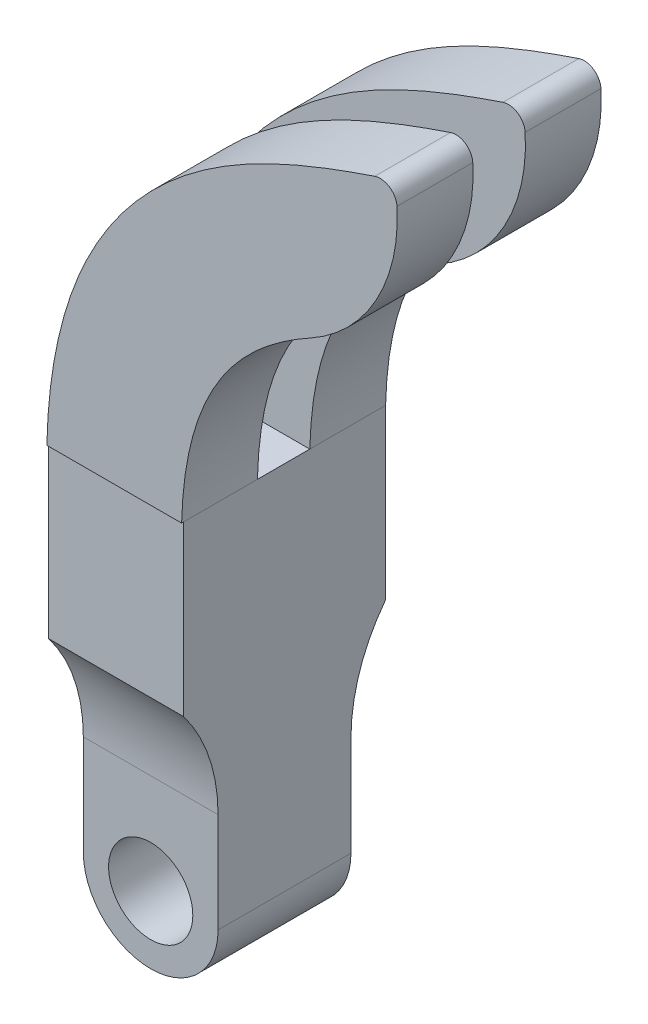
ISO-10303-21;
HEADER;
FILE_DESCRIPTION(('STEP AP214'),'2;1');
FILE_NAME('part.step','',(''),(''),'','','');
FILE_SCHEMA(('AUTOMOTIVE_DESIGN { 1 0 10303 214 1 1 1 1 }'));
ENDSEC;
DATA;
#1=APPLICATION_CONTEXT('core data for automotive mechanical design processes');
#2=APPLICATION_PROTOCOL_DEFINITION('international standard','automotive_design',2000,#1);
#3=PRODUCT_CONTEXT('',#1,'mechanical');
#4=PRODUCT('Part','Part','',(#3));
#5=PRODUCT_RELATED_PRODUCT_CATEGORY('part','',(#4));
#6=PRODUCT_DEFINITION_FORMATION('','',#4);
#7=PRODUCT_DEFINITION_CONTEXT('part definition',#1,'design');
#8=PRODUCT_DEFINITION('design','',#6,#7);
#9=PRODUCT_DEFINITION_SHAPE('','',#8);
#10=(LENGTH_UNIT() NAMED_UNIT(*) SI_UNIT(.MILLI.,.METRE.));
#11=(NAMED_UNIT(*) PLANE_ANGLE_UNIT() SI_UNIT($,.RADIAN.));
#12=(NAMED_UNIT(*) SI_UNIT($,.STERADIAN.) SOLID_ANGLE_UNIT());
#13=UNCERTAINTY_MEASURE_WITH_UNIT(LENGTH_MEASURE(1.E-05),#10,'distance_accuracy_value','');
#14=(GEOMETRIC_REPRESENTATION_CONTEXT(3) GLOBAL_UNCERTAINTY_ASSIGNED_CONTEXT((#13)) GLOBAL_UNIT_ASSIGNED_CONTEXT((#10,
#11,#12)) REPRESENTATION_CONTEXT('',''));
#15=CARTESIAN_POINT('',(0.,0.,0.));
#16=DIRECTION('',(0.,0.,1.));
#17=DIRECTION('',(1.,0.,0.));
#18=AXIS2_PLACEMENT_3D('',#15,#16,#17);
#19=CARTESIAN_POINT('',(0.,22.,0.));
#20=DIRECTION('',(0.,-1.,0.));
#21=DIRECTION('',(0.,0.,-1.));
#22=AXIS2_PLACEMENT_3D('',#19,#20,#21);
#23=PLANE('',#22);
#24=DIRECTION('',(1.,0.,0.));
#25=VECTOR('',#24,1.);
#26=CARTESIAN_POINT('',(-4.,22.,5.555));
#27=LINE('',#26,#25);
#28=CARTESIAN_POINT('',(-4.,22.,5.555));
#29=VERTEX_POINT('',#28);
#30=CARTESIAN_POINT('',(4.,22.,5.555));
#31=VERTEX_POINT('',#30);
#32=EDGE_CURVE('E170',#29,#31,#27,.T.);
#33=ORIENTED_EDGE('',*,*,#32,.T.);
#34=DIRECTION('',(0.,0.,-1.));
#35=VECTOR('',#34,1.);
#36=CARTESIAN_POINT('',(4.,22.,9.945));
#37=LINE('',#36,#35);
#38=CARTESIAN_POINT('',(4.,22.,2.445));
#39=VERTEX_POINT('',#38);
#40=EDGE_CURVE('E268',#31,#39,#37,.T.);
#41=ORIENTED_EDGE('',*,*,#40,.T.);
#42=DIRECTION('',(1.,0.,0.));
#43=VECTOR('',#42,1.);
#44=CARTESIAN_POINT('',(-4.,22.,2.445));
#45=LINE('',#44,#43);
#46=CARTESIAN_POINT('',(-4.,22.,2.445));
#47=VERTEX_POINT('',#46);
#48=EDGE_CURVE('E223',#39,#47,#45,.F.);
#49=ORIENTED_EDGE('',*,*,#48,.T.);
#50=DIRECTION('',(0.,0.,1.));
#51=VECTOR('',#50,1.);
#52=CARTESIAN_POINT('',(-4.,22.,9.945));
#53=LINE('',#52,#51);
#54=EDGE_CURVE('E274',#47,#29,#53,.T.);
#55=ORIENTED_EDGE('',*,*,#54,.T.);
#56=EDGE_LOOP('',(#33,#41,#49,#55));
#57=FACE_BOUND('',#56,.T.);
#58=ADVANCED_FACE('F39',(#57),#23,.F.);
#59=CARTESIAN_POINT('',(0.,0.,7.89));
#60=DIRECTION('',(0.,0.,1.));
#61=DIRECTION('',(1.,0.,0.));
#62=AXIS2_PLACEMENT_3D('',#59,#60,#61);
#63=PLANE('',#62);
#64=DIRECTION('',(0.,1.,0.));
#65=VECTOR('',#64,1.);
#66=CARTESIAN_POINT('',(4.,12.,7.89));
#67=LINE('',#66,#65);
#68=CARTESIAN_POINT('',(4.,0.,7.89));
#69=VERTEX_POINT('',#68);
#70=CARTESIAN_POINT('',(4.,5.92735848250533,7.89));
#71=VERTEX_POINT('',#70);
#72=EDGE_CURVE('E312',#69,#71,#67,.T.);
#73=ORIENTED_EDGE('',*,*,#72,.T.);
#74=DIRECTION('',(-1.,0.,0.));
#75=VECTOR('',#74,1.);
#76=CARTESIAN_POINT('',(-4.,5.92735848250533,7.89));
#77=LINE('',#76,#75);
#78=CARTESIAN_POINT('',(-4.,5.92735848250533,7.89));
#79=VERTEX_POINT('',#78);
#80=EDGE_CURVE('E340',#71,#79,#77,.T.);
#81=ORIENTED_EDGE('',*,*,#80,.T.);
#82=DIRECTION('',(0.,-1.,0.));
#83=VECTOR('',#82,1.);
#84=CARTESIAN_POINT('',(-4.,0.,7.89));
#85=LINE('',#84,#83);
#86=CARTESIAN_POINT('',(-4.,0.,7.89));
#87=VERTEX_POINT('',#86);
#88=EDGE_CURVE('E317',#79,#87,#85,.T.);
#89=ORIENTED_EDGE('',*,*,#88,.T.);
#90=CARTESIAN_POINT('',(0.,0.,7.89));
#91=DIRECTION('',(0.,0.,1.));
#92=DIRECTION('',(1.,0.,0.));
#93=AXIS2_PLACEMENT_3D('',#90,#91,#92);
#94=CIRCLE('',#93,4.);
#95=EDGE_CURVE('E308',#87,#69,#94,.T.);
#96=ORIENTED_EDGE('',*,*,#95,.T.);
#97=EDGE_LOOP('',(#73,#81,#89,#96));
#98=FACE_BOUND('',#97,.T.);
#99=CARTESIAN_POINT('',(0.,0.,7.89));
#100=DIRECTION('',(0.,0.,1.));
#101=DIRECTION('',(1.,0.,0.));
#102=AXIS2_PLACEMENT_3D('',#99,#100,#101);
#103=CIRCLE('',#102,2.5);
#104=CARTESIAN_POINT('',(2.5,0.,7.89));
#105=VERTEX_POINT('',#104);
#106=EDGE_CURVE('E300',#105,#105,#103,.T.);
#107=ORIENTED_EDGE('',*,*,#106,.F.);
#108=EDGE_LOOP('',(#107));
#109=FACE_BOUND('',#108,.T.);
#110=ADVANCED_FACE('F437',(#98,#109),#63,.T.);
#111=CARTESIAN_POINT('',(0.,0.,0.));
#112=DIRECTION('',(0.,0.,1.));
#113=DIRECTION('',(1.,0.,0.));
#114=AXIS2_PLACEMENT_3D('',#111,#112,#113);
#115=PLANE('',#114);
#116=DIRECTION('',(0.,-1.,0.));
#117=VECTOR('',#116,1.);
#118=CARTESIAN_POINT('',(-4.,0.,0.));
#119=LINE('',#118,#117);
#120=CARTESIAN_POINT('',(-4.,5.92735848250533,0.));
#121=VERTEX_POINT('',#120);
#122=CARTESIAN_POINT('',(-4.,0.,0.));
#123=VERTEX_POINT('',#122);
#124=EDGE_CURVE('E313',#121,#123,#119,.T.);
#125=ORIENTED_EDGE('',*,*,#124,.F.);
#126=DIRECTION('',(-1.,0.,0.));
#127=VECTOR('',#126,1.);
#128=CARTESIAN_POINT('',(0.,5.92735848250533,0.));
#129=LINE('',#128,#127);
#130=CARTESIAN_POINT('',(4.,5.92735848250533,0.));
#131=VERTEX_POINT('',#130);
#132=EDGE_CURVE('E337',#121,#131,#129,.F.);
#133=ORIENTED_EDGE('',*,*,#132,.T.);
#134=DIRECTION('',(0.,1.,0.));
#135=VECTOR('',#134,1.);
#136=CARTESIAN_POINT('',(4.,12.,0.));
#137=LINE('',#136,#135);
#138=CARTESIAN_POINT('',(4.,0.,0.));
#139=VERTEX_POINT('',#138);
#140=EDGE_CURVE('E324',#139,#131,#137,.T.);
#141=ORIENTED_EDGE('',*,*,#140,.F.);
#142=CARTESIAN_POINT('',(0.,0.,0.));
#143=DIRECTION('',(0.,0.,1.));
#144=DIRECTION('',(1.,0.,0.));
#145=AXIS2_PLACEMENT_3D('',#142,#143,#144);
#146=CIRCLE('',#145,4.);
#147=EDGE_CURVE('E304',#123,#139,#146,.T.);
#148=ORIENTED_EDGE('',*,*,#147,.F.);
#149=EDGE_LOOP('',(#125,#133,#141,#148));
#150=FACE_BOUND('',#149,.T.);
#151=CARTESIAN_POINT('',(0.,0.,0.));
#152=DIRECTION('',(0.,0.,1.));
#153=DIRECTION('',(1.,0.,0.));
#154=AXIS2_PLACEMENT_3D('',#151,#152,#153);
#155=CIRCLE('',#154,2.5);
#156=CARTESIAN_POINT('',(2.5,0.,0.));
#157=VERTEX_POINT('',#156);
#158=EDGE_CURVE('E299',#157,#157,#155,.T.);
#159=ORIENTED_EDGE('',*,*,#158,.T.);
#160=EDGE_LOOP('',(#159));
#161=FACE_BOUND('',#160,.T.);
#162=ADVANCED_FACE('F429',(#150,#161),#115,.F.);
#163=CARTESIAN_POINT('',(0.,0.,7.89));
#164=DIRECTION('',(0.,0.,-1.));
#165=DIRECTION('',(-1.,0.,0.));
#166=AXIS2_PLACEMENT_3D('',#163,#164,#165);
#167=CYLINDRICAL_SURFACE('',#166,4.);
#168=ORIENTED_EDGE('',*,*,#147,.T.);
#169=DIRECTION('',(0.,0.,-1.));
#170=VECTOR('',#169,1.);
#171=CARTESIAN_POINT('',(4.,0.,7.89));
#172=LINE('',#171,#170);
#173=EDGE_CURVE('E333',#69,#139,#172,.T.);
#174=ORIENTED_EDGE('',*,*,#173,.F.);
#175=ORIENTED_EDGE('',*,*,#95,.F.);
#176=DIRECTION('',(0.,0.,-1.));
#177=VECTOR('',#176,1.);
#178=CARTESIAN_POINT('',(-4.,0.,7.89));
#179=LINE('',#178,#177);
#180=EDGE_CURVE('E320',#87,#123,#179,.T.);
#181=ORIENTED_EDGE('',*,*,#180,.T.);
#182=EDGE_LOOP('',(#168,#174,#175,#181));
#183=FACE_BOUND('',#182,.T.);
#184=ADVANCED_FACE('F433',(#183),#167,.T.);
#185=CARTESIAN_POINT('',(4.,12.,7.89));
#186=DIRECTION('',(-1.,0.,0.));
#187=DIRECTION('',(0.,0.,1.));
#188=AXIS2_PLACEMENT_3D('',#185,#186,#187);
#189=PLANE('',#188);
#190=ORIENTED_EDGE('',*,*,#140,.T.);
#191=CARTESIAN_POINT('',(4.,5.92735848250533,-10.));
#192=DIRECTION('',(-1.,0.,0.));
#193=DIRECTION('',(0.,0.,1.));
#194=AXIS2_PLACEMENT_3D('',#191,#192,#193);
#195=CIRCLE('',#194,10.);
#196=CARTESIAN_POINT('',(4.,12.,-2.055));
#197=VERTEX_POINT('',#196);
#198=EDGE_CURVE('E347',#131,#197,#195,.T.);
#199=ORIENTED_EDGE('',*,*,#198,.T.);
#200=DIRECTION('',(0.,-1.,0.));
#201=VECTOR('',#200,1.);
#202=CARTESIAN_POINT('',(4.,22.,-2.055));
#203=LINE('',#202,#201);
#204=CARTESIAN_POINT('',(4.,22.,-2.055));
#205=VERTEX_POINT('',#204);
#206=EDGE_CURVE('E295',#205,#197,#203,.T.);
#207=ORIENTED_EDGE('',*,*,#206,.F.);
#208=DIRECTION('',(0.,0.,1.));
#209=VECTOR('',#208,1.);
#210=CARTESIAN_POINT('',(4.,22.,-2.055));
#211=LINE('',#210,#209);
#212=EDGE_CURVE('E215',#205,#39,#211,.T.);
#213=ORIENTED_EDGE('',*,*,#212,.T.);
#214=ORIENTED_EDGE('',*,*,#40,.F.);
#215=CARTESIAN_POINT('',(4.,22.,9.945));
#216=VERTEX_POINT('',#215);
#217=EDGE_CURVE('E261',#216,#31,#37,.T.);
#218=ORIENTED_EDGE('',*,*,#217,.F.);
#219=DIRECTION('',(0.,-1.,0.));
#220=VECTOR('',#219,1.);
#221=CARTESIAN_POINT('',(4.,22.,9.945));
#222=LINE('',#221,#220);
#223=CARTESIAN_POINT('',(4.,12.,9.945));
#224=VERTEX_POINT('',#223);
#225=EDGE_CURVE('E277',#216,#224,#222,.T.);
#226=ORIENTED_EDGE('',*,*,#225,.T.);
#227=CARTESIAN_POINT('',(4.,5.92735848250533,17.89));
#228=DIRECTION('',(-1.,0.,0.));
#229=DIRECTION('',(0.,0.,1.));
#230=AXIS2_PLACEMENT_3D('',#227,#228,#229);
#231=CIRCLE('',#230,10.);
#232=EDGE_CURVE('E353',#224,#71,#231,.T.);
#233=ORIENTED_EDGE('',*,*,#232,.T.);
#234=ORIENTED_EDGE('',*,*,#72,.F.);
#235=ORIENTED_EDGE('',*,*,#173,.T.);
#236=EDGE_LOOP('',(#190,#199,#207,#213,#214,#218,#226,#233,#234,#235));
#237=FACE_BOUND('',#236,.T.);
#238=ADVANCED_FACE('F413',(#237),#189,.F.);
#239=CARTESIAN_POINT('',(-4.,0.,7.89));
#240=DIRECTION('',(1.,0.,0.));
#241=DIRECTION('',(0.,0.,-1.));
#242=AXIS2_PLACEMENT_3D('',#239,#240,#241);
#243=PLANE('',#242);
#244=DIRECTION('',(0.,-1.,0.));
#245=VECTOR('',#244,1.);
#246=CARTESIAN_POINT('',(-4.,22.,-2.055));
#247=LINE('',#246,#245);
#248=CARTESIAN_POINT('',(-4.,22.,-2.055));
#249=VERTEX_POINT('',#248);
#250=CARTESIAN_POINT('',(-4.,12.,-2.055));
#251=VERTEX_POINT('',#250);
#252=EDGE_CURVE('E291',#249,#251,#247,.T.);
#253=ORIENTED_EDGE('',*,*,#252,.T.);
#254=CARTESIAN_POINT('',(-4.,5.92735848250533,-10.));
#255=DIRECTION('',(1.,0.,0.));
#256=DIRECTION('',(0.,0.,-1.));
#257=AXIS2_PLACEMENT_3D('',#254,#255,#256);
#258=CIRCLE('',#257,10.);
#259=EDGE_CURVE('E344',#251,#121,#258,.T.);
#260=ORIENTED_EDGE('',*,*,#259,.T.);
#261=ORIENTED_EDGE('',*,*,#124,.T.);
#262=ORIENTED_EDGE('',*,*,#180,.F.);
#263=ORIENTED_EDGE('',*,*,#88,.F.);
#264=CARTESIAN_POINT('',(-4.,5.92735848250533,17.89));
#265=DIRECTION('',(1.,0.,0.));
#266=DIRECTION('',(0.,0.,-1.));
#267=AXIS2_PLACEMENT_3D('',#264,#265,#266);
#268=CIRCLE('',#267,10.);
#269=CARTESIAN_POINT('',(-4.,12.,9.945));
#270=VERTEX_POINT('',#269);
#271=EDGE_CURVE('E350',#79,#270,#268,.T.);
#272=ORIENTED_EDGE('',*,*,#271,.T.);
#273=DIRECTION('',(0.,-1.,0.));
#274=VECTOR('',#273,1.);
#275=CARTESIAN_POINT('',(-4.,22.,9.945));
#276=LINE('',#275,#274);
#277=CARTESIAN_POINT('',(-4.,22.,9.945));
#278=VERTEX_POINT('',#277);
#279=EDGE_CURVE('E287',#278,#270,#276,.T.);
#280=ORIENTED_EDGE('',*,*,#279,.F.);
#281=EDGE_CURVE('E166',#29,#278,#53,.T.);
#282=ORIENTED_EDGE('',*,*,#281,.F.);
#283=ORIENTED_EDGE('',*,*,#54,.F.);
#284=EDGE_CURVE('E269',#249,#47,#53,.T.);
#285=ORIENTED_EDGE('',*,*,#284,.F.);
#286=EDGE_LOOP('',(#253,#260,#261,#262,#263,#272,#280,#282,#283,#285));
#287=FACE_BOUND('',#286,.T.);
#288=ADVANCED_FACE('F424',(#287),#243,.F.);
#289=CARTESIAN_POINT('',(0.,0.,7.89));
#290=DIRECTION('',(0.,0.,-1.));
#291=DIRECTION('',(-1.,0.,0.));
#292=AXIS2_PLACEMENT_3D('',#289,#290,#291);
#293=CYLINDRICAL_SURFACE('',#292,2.5);
#294=ORIENTED_EDGE('',*,*,#106,.T.);
#295=EDGE_LOOP('',(#294));
#296=FACE_BOUND('',#295,.T.);
#297=ORIENTED_EDGE('',*,*,#158,.F.);
#298=EDGE_LOOP('',(#297));
#299=FACE_BOUND('',#298,.T.);
#300=ADVANCED_FACE('F479',(#296,#299),#293,.F.);
#301=CARTESIAN_POINT('',(-4.,22.,-2.055));
#302=DIRECTION('',(0.,0.,1.));
#303=DIRECTION('',(1.,0.,0.));
#304=AXIS2_PLACEMENT_3D('',#301,#302,#303);
#305=PLANE('',#304);
#306=CARTESIAN_POINT('',(-4.,22.,-2.055));
#307=CARTESIAN_POINT('',(-3.92436570164534,25.61070672902,-2.055));
#308=CARTESIAN_POINT('',(-3.27888909664769,28.9902401654092,-2.055));
#309=CARTESIAN_POINT('',(-1.32692427520148,33.4679210505579,-2.055));
#310=CARTESIAN_POINT('',(-0.516042652210227,34.8539065515553,-2.055));
#311=CARTESIAN_POINT('',(1.33826613264258,37.3326125635875,-2.055));
#312=CARTESIAN_POINT('',(2.37828003619013,38.4234347527022,-2.055));
#313=CARTESIAN_POINT('',(5.63936836760016,41.2496385229798,-2.055));
#314=CARTESIAN_POINT('',(7.96915549823336,42.5407193280522,-2.055));
#315=CARTESIAN_POINT('',(12.4369756060285,44.5501001679601,-2.055));
#316=CARTESIAN_POINT('',(14.6000594428986,45.2811143011134,-2.055));
#317=CARTESIAN_POINT('',(16.6287225376801,45.9545285707047,-2.055));
#318=B_SPLINE_CURVE_WITH_KNOTS('',3,(#306,#307,#308,#309,#310,#311,#312,#313,#314,#315,#316,
#317),.UNSPECIFIED.,.F.,.F.,(4,2,2,2,2,4),(0.,0.25,0.375,0.5,0.75,1.),.UNSPECIFIED.);
#319=CARTESIAN_POINT('',(15.4681083184052,45.566293978472,-2.055));
#320=VERTEX_POINT('',#319);
#321=EDGE_CURVE('E251',#249,#320,#318,.T.);
#322=ORIENTED_EDGE('',*,*,#321,.T.);
#323=CARTESIAN_POINT('',(15.7886170511822,44.6190484177996,-2.055));
#324=DIRECTION('',(0.,0.,1.));
#325=DIRECTION('',(1.,0.,0.));
#326=AXIS2_PLACEMENT_3D('',#323,#324,#325);
#327=CIRCLE('',#326,1.);
#328=CARTESIAN_POINT('',(16.7868829930064,44.677913597608,-2.055));
#329=VERTEX_POINT('',#328);
#330=EDGE_CURVE('E371',#320,#329,#327,.F.);
#331=ORIENTED_EDGE('',*,*,#330,.T.);
#332=CARTESIAN_POINT('',(6.80422357476456,44.0892617995237,-2.055));
#333=DIRECTION('',(0.,0.,1.));
#334=DIRECTION('',(1.,0.,0.));
#335=AXIS2_PLACEMENT_3D('',#332,#333,#334);
#336=CIRCLE('',#335,10.);
#337=CARTESIAN_POINT('',(11.6332611134642,35.3325274510448,-2.055));
#338=VERTEX_POINT('',#337);
#339=EDGE_CURVE('E364',#329,#338,#336,.F.);
#340=ORIENTED_EDGE('',*,*,#339,.T.);
#341=CARTESIAN_POINT('',(4.,22.,-2.055));
#342=CARTESIAN_POINT('',(4.07600464265665,24.7891005232588,-2.055));
#343=CARTESIAN_POINT('',(4.57674442220723,27.0460758728325,-2.055));
#344=CARTESIAN_POINT('',(5.82553724778613,29.8326793332308,-2.055));
#345=CARTESIAN_POINT('',(6.32474871718443,30.6617372233515,-2.055));
#346=CARTESIAN_POINT('',(7.46582944736926,32.1534545158627,-2.055));
#347=CARTESIAN_POINT('',(8.10769871103599,32.8161139141586,-2.055));
#348=CARTESIAN_POINT('',(10.2124383013451,34.6043264247829,-2.055));
#349=CARTESIAN_POINT('',(11.8544404363032,35.5301138401075,-2.055));
#350=CARTESIAN_POINT('',(15.430236778017,37.114751086829,-2.055));
#351=CARTESIAN_POINT('',(17.3640309888834,37.7736009142664,-2.055));
#352=CARTESIAN_POINT('',(19.350774872179,38.4318674000651,-2.055));
#353=B_SPLINE_CURVE_WITH_KNOTS('',3,(#341,#342,#343,#344,#345,#346,#347,#348,#349,#350,#351,
#352),.UNSPECIFIED.,.F.,.F.,(4,2,2,2,2,4),(0.,0.25,0.375,0.5,0.75,1.),.UNSPECIFIED.);
#354=EDGE_CURVE('E231',#205,#338,#353,.T.);
#355=ORIENTED_EDGE('',*,*,#354,.F.);
#356=ORIENTED_EDGE('',*,*,#206,.T.);
#357=DIRECTION('',(-1.,0.,0.));
#358=VECTOR('',#357,1.);
#359=CARTESIAN_POINT('',(-4.,12.,-2.055));
#360=LINE('',#359,#358);
#361=EDGE_CURVE('E260',#197,#251,#360,.T.);
#362=ORIENTED_EDGE('',*,*,#361,.T.);
#363=ORIENTED_EDGE('',*,*,#252,.F.);
#364=EDGE_LOOP('',(#322,#331,#340,#355,#356,#362,#363));
#365=FACE_BOUND('',#364,.T.);
#366=ADVANCED_FACE('F417',(#365),#305,.F.);
#367=CARTESIAN_POINT('',(-4.,22.,9.945));
#368=DIRECTION('',(0.,0.,-1.));
#369=DIRECTION('',(-1.,0.,0.));
#370=AXIS2_PLACEMENT_3D('',#367,#368,#369);
#371=PLANE('',#370);
#372=DIRECTION('',(1.,0.,0.));
#373=VECTOR('',#372,1.);
#374=CARTESIAN_POINT('',(-4.,12.,9.945));
#375=LINE('',#374,#373);
#376=EDGE_CURVE('E281',#270,#224,#375,.T.);
#377=ORIENTED_EDGE('',*,*,#376,.T.);
#378=ORIENTED_EDGE('',*,*,#225,.F.);
#379=DIRECTION('',(1.,0.,0.));
#380=VECTOR('',#379,1.);
#381=CARTESIAN_POINT('',(-4.,22.,9.945));
#382=LINE('',#381,#380);
#383=EDGE_CURVE('E273',#278,#216,#382,.T.);
#384=ORIENTED_EDGE('',*,*,#383,.F.);
#385=ORIENTED_EDGE('',*,*,#279,.T.);
#386=EDGE_LOOP('',(#377,#378,#384,#385));
#387=FACE_BOUND('',#386,.T.);
#388=ADVANCED_FACE('F445',(#387),#371,.F.);
#389=CARTESIAN_POINT('',(0.,5.92735848250533,-10.));
#390=DIRECTION('',(-1.,0.,0.));
#391=DIRECTION('',(0.,0.,1.));
#392=AXIS2_PLACEMENT_3D('',#389,#390,#391);
#393=CYLINDRICAL_SURFACE('',#392,10.);
#394=ORIENTED_EDGE('',*,*,#198,.F.);
#395=ORIENTED_EDGE('',*,*,#132,.F.);
#396=ORIENTED_EDGE('',*,*,#259,.F.);
#397=ORIENTED_EDGE('',*,*,#361,.F.);
#398=EDGE_LOOP('',(#394,#395,#396,#397));
#399=FACE_BOUND('',#398,.T.);
#400=ADVANCED_FACE('F420',(#399),#393,.F.);
#401=CARTESIAN_POINT('',(0.,5.92735848250533,17.89));
#402=DIRECTION('',(1.,0.,0.));
#403=DIRECTION('',(0.,0.,-1.));
#404=AXIS2_PLACEMENT_3D('',#401,#402,#403);
#405=CYLINDRICAL_SURFACE('',#404,10.);
#406=ORIENTED_EDGE('',*,*,#232,.F.);
#407=ORIENTED_EDGE('',*,*,#376,.F.);
#408=ORIENTED_EDGE('',*,*,#271,.F.);
#409=ORIENTED_EDGE('',*,*,#80,.F.);
#410=EDGE_LOOP('',(#406,#407,#408,#409));
#411=FACE_BOUND('',#410,.T.);
#412=ADVANCED_FACE('F442',(#411),#405,.F.);
#413=CARTESIAN_POINT('',(4.,22.,-2.055));
#414=CARTESIAN_POINT('',(4.07600464265665,24.7891005232588,-2.055));
#415=CARTESIAN_POINT('',(4.57674442220723,27.0460758728325,-2.055));
#416=CARTESIAN_POINT('',(5.82553724778613,29.8326793332308,-2.055));
#417=CARTESIAN_POINT('',(6.32474871718443,30.6617372233515,-2.055));
#418=CARTESIAN_POINT('',(7.46582944736926,32.1534545158627,-2.055));
#419=CARTESIAN_POINT('',(8.10769871103599,32.8161139141586,-2.055));
#420=CARTESIAN_POINT('',(10.2124383013451,34.6043264247829,-2.055));
#421=CARTESIAN_POINT('',(11.8544404363032,35.5301138401075,-2.055));
#422=CARTESIAN_POINT('',(15.430236778017,37.114751086829,-2.055));
#423=CARTESIAN_POINT('',(17.3640309888834,37.7736009142664,-2.055));
#424=CARTESIAN_POINT('',(19.350774872179,38.4318674000651,-2.055));
#425=CARTESIAN_POINT('',(4.,22.,2.445));
#426=CARTESIAN_POINT('',(4.07600464265665,24.7891005232588,2.445));
#427=CARTESIAN_POINT('',(4.57674442220723,27.0460758728325,2.445));
#428=CARTESIAN_POINT('',(5.82553724778613,29.8326793332308,2.445));
#429=CARTESIAN_POINT('',(6.32474871718443,30.6617372233515,2.445));
#430=CARTESIAN_POINT('',(7.46582944736926,32.1534545158627,2.445));
#431=CARTESIAN_POINT('',(8.10769871103599,32.8161139141586,2.445));
#432=CARTESIAN_POINT('',(10.2124383013451,34.6043264247829,2.445));
#433=CARTESIAN_POINT('',(11.8544404363032,35.5301138401075,2.445));
#434=CARTESIAN_POINT('',(15.430236778017,37.114751086829,2.445));
#435=CARTESIAN_POINT('',(17.3640309888769,37.773600914286,2.445));
#436=CARTESIAN_POINT('',(19.350774872179,38.4318674000651,2.445));
#437=B_SPLINE_SURFACE_WITH_KNOTS('',1,3,((#413,#414,#415,#416,#417,#418,#419,#420,#421,#422,
#423,#424),(#425,#426,#427,#428,#429,#430,#431,#432,#433,#434,#435,#436)),.UNSPECIFIED.,.F.,.F.,
.F.,(2,2),(4,2,2,2,2,4),(0.,1.),(0.,0.25,0.375,0.5,0.75,1.),.UNSPECIFIED.);
#438=DIRECTION('',(0.,0.,1.));
#439=VECTOR('',#438,1.);
#440=CARTESIAN_POINT('',(11.6332611134642,35.3325274510448,-2.055));
#441=LINE('',#440,#439);
#442=CARTESIAN_POINT('',(11.6332611134642,35.3325274510448,2.445));
#443=VERTEX_POINT('',#442);
#444=EDGE_CURVE('E356',#338,#443,#441,.T.);
#445=CARTESIAN_POINT('',(4.,22.,2.445));
#446=CARTESIAN_POINT('',(4.07600464265665,24.7891005232588,2.445));
#447=CARTESIAN_POINT('',(4.57674442220723,27.0460758728325,2.445));
#448=CARTESIAN_POINT('',(5.82553724778613,29.8326793332308,2.445));
#449=CARTESIAN_POINT('',(6.32474871718443,30.6617372233515,2.445));
#450=CARTESIAN_POINT('',(7.46582944736926,32.1534545158627,2.445));
#451=CARTESIAN_POINT('',(8.10769871103599,32.8161139141586,2.445));
#452=CARTESIAN_POINT('',(10.2124383013451,34.6043264247829,2.445));
#453=CARTESIAN_POINT('',(11.8544404363032,35.5301138401075,2.445));
#454=CARTESIAN_POINT('',(15.430236778017,37.114751086829,2.445));
#455=CARTESIAN_POINT('',(17.3640309888769,37.773600914286,2.445));
#456=CARTESIAN_POINT('',(19.350774872179,38.4318674000651,2.445));
#457=B_SPLINE_CURVE_WITH_KNOTS('',3,(#445,#446,#447,#448,#449,#450,#451,#452,#453,#454,#455,
#456),.UNSPECIFIED.,.F.,.F.,(4,2,2,2,2,4),(0.,0.25,0.375,0.5,0.75,1.),.UNSPECIFIED.);
#458=EDGE_CURVE('E224',#39,#443,#457,.T.);
#459=ORIENTED_EDGE('',*,*,#354,.T.);
#460=ORIENTED_EDGE('',*,*,#444,.T.);
#461=ORIENTED_EDGE('',*,*,#458,.F.);
#462=ORIENTED_EDGE('',*,*,#212,.F.);
#463=EDGE_LOOP('',(#459,#460,#461,#462));
#464=FACE_BOUND('',#463,.T.);
#465=ADVANCED_FACE('F409',(#464),#437,.F.);
#466=CARTESIAN_POINT('',(-4.,22.,2.445));
#467=DIRECTION('',(0.,0.,1.));
#468=DIRECTION('',(1.,0.,0.));
#469=AXIS2_PLACEMENT_3D('',#466,#467,#468);
#470=PLANE('',#469);
#471=CARTESIAN_POINT('',(6.80422357476456,44.0892617995237,2.445));
#472=DIRECTION('',(0.,0.,1.));
#473=DIRECTION('',(1.,0.,0.));
#474=AXIS2_PLACEMENT_3D('',#471,#472,#473);
#475=CIRCLE('',#474,10.);
#476=CARTESIAN_POINT('',(16.7868829930064,44.677913597608,2.445));
#477=VERTEX_POINT('',#476);
#478=EDGE_CURVE('E360',#443,#477,#475,.T.);
#479=ORIENTED_EDGE('',*,*,#478,.T.);
#480=CARTESIAN_POINT('',(15.7886170511822,44.6190484177996,2.445));
#481=DIRECTION('',(0.,0.,1.));
#482=DIRECTION('',(1.,0.,0.));
#483=AXIS2_PLACEMENT_3D('',#480,#481,#482);
#484=CIRCLE('',#483,1.);
#485=CARTESIAN_POINT('',(15.4681083184052,45.566293978472,2.445));
#486=VERTEX_POINT('',#485);
#487=EDGE_CURVE('E377',#477,#486,#484,.T.);
#488=ORIENTED_EDGE('',*,*,#487,.T.);
#489=CARTESIAN_POINT('',(-4.,22.,2.445));
#490=CARTESIAN_POINT('',(-3.92436570164534,25.61070672902,2.445));
#491=CARTESIAN_POINT('',(-3.27888909664769,28.9902401654092,2.445));
#492=CARTESIAN_POINT('',(-1.32692427520148,33.4679210505579,2.445));
#493=CARTESIAN_POINT('',(-0.516042652210227,34.8539065515553,2.445));
#494=CARTESIAN_POINT('',(1.33826613264258,37.3326125635875,2.445));
#495=CARTESIAN_POINT('',(2.37828003619013,38.4234347527022,2.445));
#496=CARTESIAN_POINT('',(5.63936836760016,41.2496385229798,2.445));
#497=CARTESIAN_POINT('',(7.96915549823336,42.5407193280522,2.445));
#498=CARTESIAN_POINT('',(12.4369756060285,44.5501001679601,2.445));
#499=CARTESIAN_POINT('',(14.6000594428986,45.2811143011134,2.445));
#500=CARTESIAN_POINT('',(16.6287225376801,45.9545285707047,2.445));
#501=B_SPLINE_CURVE_WITH_KNOTS('',3,(#489,#490,#491,#492,#493,#494,#495,#496,#497,#498,#499,
#500),.UNSPECIFIED.,.F.,.F.,(4,2,2,2,2,4),(0.,0.25,0.375,0.5,0.75,1.),.UNSPECIFIED.);
#502=EDGE_CURVE('E230',#47,#486,#501,.T.);
#503=ORIENTED_EDGE('',*,*,#502,.F.);
#504=ORIENTED_EDGE('',*,*,#48,.F.);
#505=ORIENTED_EDGE('',*,*,#458,.T.);
#506=EDGE_LOOP('',(#479,#488,#503,#504,#505));
#507=FACE_BOUND('',#506,.T.);
#508=ADVANCED_FACE('F407',(#507),#470,.T.);
#509=CARTESIAN_POINT('',(-4.,22.,2.445));
#510=CARTESIAN_POINT('',(-3.92436570164534,25.61070672902,2.445));
#511=CARTESIAN_POINT('',(-3.27888909664769,28.9902401654092,2.445));
#512=CARTESIAN_POINT('',(-1.32692427520148,33.4679210505579,2.445));
#513=CARTESIAN_POINT('',(-0.516042652210227,34.8539065515553,2.445));
#514=CARTESIAN_POINT('',(1.33826613264258,37.3326125635875,2.445));
#515=CARTESIAN_POINT('',(2.37828003619013,38.4234347527022,2.445));
#516=CARTESIAN_POINT('',(5.63936836760016,41.2496385229798,2.445));
#517=CARTESIAN_POINT('',(7.96915549823336,42.5407193280522,2.445));
#518=CARTESIAN_POINT('',(12.4369756060285,44.5501001679601,2.445));
#519=CARTESIAN_POINT('',(14.6000594428986,45.2811143011134,2.445));
#520=CARTESIAN_POINT('',(16.6287225376801,45.9545285707047,2.445));
#521=CARTESIAN_POINT('',(-4.,22.,-2.055));
#522=CARTESIAN_POINT('',(-3.92436570164534,25.61070672902,-2.055));
#523=CARTESIAN_POINT('',(-3.27888909664769,28.9902401654092,-2.055));
#524=CARTESIAN_POINT('',(-1.32692427520148,33.4679210505579,-2.055));
#525=CARTESIAN_POINT('',(-0.516042652210227,34.8539065515553,-2.055));
#526=CARTESIAN_POINT('',(1.33826613264258,37.3326125635875,-2.055));
#527=CARTESIAN_POINT('',(2.37828003619013,38.4234347527022,-2.055));
#528=CARTESIAN_POINT('',(5.63936836760016,41.2496385229798,-2.055));
#529=CARTESIAN_POINT('',(7.96915549823336,42.5407193280522,-2.055));
#530=CARTESIAN_POINT('',(12.4369756060285,44.5501001679601,-2.055));
#531=CARTESIAN_POINT('',(14.6000594428986,45.2811143011134,-2.055));
#532=CARTESIAN_POINT('',(16.6287225376801,45.9545285707047,-2.055));
#533=B_SPLINE_SURFACE_WITH_KNOTS('',1,3,((#509,#510,#511,#512,#513,#514,#515,#516,#517,#518,
#519,#520),(#521,#522,#523,#524,#525,#526,#527,#528,#529,#530,#531,#532)),.UNSPECIFIED.,.F.,.F.,
.F.,(2,2),(4,2,2,2,2,4),(0.,1.),(0.,0.25,0.375,0.5,0.75,1.),.UNSPECIFIED.);
#534=DIRECTION('',(0.,0.,-1.));
#535=VECTOR('',#534,1.);
#536=CARTESIAN_POINT('',(15.4681083184052,45.566293978472,2.445));
#537=LINE('',#536,#535);
#538=EDGE_CURVE('E367',#486,#320,#537,.T.);
#539=ORIENTED_EDGE('',*,*,#502,.T.);
#540=ORIENTED_EDGE('',*,*,#538,.T.);
#541=ORIENTED_EDGE('',*,*,#321,.F.);
#542=ORIENTED_EDGE('',*,*,#284,.T.);
#543=EDGE_LOOP('',(#539,#540,#541,#542));
#544=FACE_BOUND('',#543,.T.);
#545=ADVANCED_FACE('F471',(#544),#533,.F.);
#546=CARTESIAN_POINT('',(6.80422357476456,44.0892617995237,0.195000000000004));
#547=DIRECTION('',(0.,0.,1.));
#548=DIRECTION('',(1.,0.,0.));
#549=AXIS2_PLACEMENT_3D('',#546,#547,#548);
#550=CYLINDRICAL_SURFACE('',#549,10.);
#551=ORIENTED_EDGE('',*,*,#339,.F.);
#552=DIRECTION('',(0.,0.,1.));
#553=VECTOR('',#552,1.);
#554=CARTESIAN_POINT('',(16.7868829930064,44.677913597608,0.195));
#555=LINE('',#554,#553);
#556=EDGE_CURVE('E374',#329,#477,#555,.T.);
#557=ORIENTED_EDGE('',*,*,#556,.T.);
#558=ORIENTED_EDGE('',*,*,#478,.F.);
#559=ORIENTED_EDGE('',*,*,#444,.F.);
#560=EDGE_LOOP('',(#551,#557,#558,#559));
#561=FACE_BOUND('',#560,.T.);
#562=ADVANCED_FACE('F495',(#561),#550,.T.);
#563=CARTESIAN_POINT('',(15.7886170511822,44.6190484177996,0.195));
#564=DIRECTION('',(0.,0.,-1.));
#565=DIRECTION('',(-1.,0.,0.));
#566=AXIS2_PLACEMENT_3D('',#563,#564,#565);
#567=CYLINDRICAL_SURFACE('',#566,1.);
#568=ORIENTED_EDGE('',*,*,#487,.F.);
#569=ORIENTED_EDGE('',*,*,#556,.F.);
#570=ORIENTED_EDGE('',*,*,#330,.F.);
#571=ORIENTED_EDGE('',*,*,#538,.F.);
#572=EDGE_LOOP('',(#568,#569,#570,#571));
#573=FACE_BOUND('',#572,.T.);
#574=ADVANCED_FACE('F497',(#573),#567,.T.);
#575=CARTESIAN_POINT('',(0.,22.,8.));
#576=DIRECTION('',(0.,1.,0.));
#577=DIRECTION('',(0.,0.,-1.));
#578=AXIS2_PLACEMENT_3D('',#575,#576,#577);
#579=PLANE('',#578);
#580=DIRECTION('',(0.,0.,1.));
#581=VECTOR('',#580,1.);
#582=CARTESIAN_POINT('',(-4.,22.,5.555));
#583=LINE('',#582,#581);
#584=CARTESIAN_POINT('',(-4.,22.,10.055));
#585=VERTEX_POINT('',#584);
#586=EDGE_CURVE('E158',#585,#278,#583,.F.);
#587=ORIENTED_EDGE('',*,*,#586,.T.);
#588=ORIENTED_EDGE('',*,*,#383,.T.);
#589=DIRECTION('',(0.,0.,-1.));
#590=VECTOR('',#589,1.);
#591=CARTESIAN_POINT('',(4.,22.,10.055));
#592=LINE('',#591,#590);
#593=CARTESIAN_POINT('',(4.,22.,10.055));
#594=VERTEX_POINT('',#593);
#595=EDGE_CURVE('E176',#216,#594,#592,.F.);
#596=ORIENTED_EDGE('',*,*,#595,.T.);
#597=DIRECTION('',(1.,0.,0.));
#598=VECTOR('',#597,1.);
#599=CARTESIAN_POINT('',(-4.,22.,10.055));
#600=LINE('',#599,#598);
#601=EDGE_CURVE('E173',#594,#585,#600,.F.);
#602=ORIENTED_EDGE('',*,*,#601,.T.);
#603=EDGE_LOOP('',(#587,#588,#596,#602));
#604=FACE_BOUND('',#603,.T.);
#605=ADVANCED_FACE('F174',(#604),#579,.F.);
#606=CARTESIAN_POINT('',(-4.,22.,10.055));
#607=CARTESIAN_POINT('',(-3.92436570164534,25.61070672902,10.055));
#608=CARTESIAN_POINT('',(-3.27888909664769,28.9902401654092,10.055));
#609=CARTESIAN_POINT('',(-1.32692427520148,33.4679210505579,10.055));
#610=CARTESIAN_POINT('',(-0.516042652210227,34.8539065515553,10.055));
#611=CARTESIAN_POINT('',(1.33826613264258,37.3326125635875,10.055));
#612=CARTESIAN_POINT('',(2.37828003619013,38.4234347527022,10.055));
#613=CARTESIAN_POINT('',(5.63936836760016,41.2496385229798,10.055));
#614=CARTESIAN_POINT('',(7.96915549823336,42.5407193280522,10.055));
#615=CARTESIAN_POINT('',(12.4369756060285,44.5501001679601,10.055));
#616=CARTESIAN_POINT('',(14.6000594428986,45.2811143011134,10.055));
#617=CARTESIAN_POINT('',(16.6287225376801,45.9545285707047,10.055));
#618=CARTESIAN_POINT('',(-4.,22.,5.555));
#619=CARTESIAN_POINT('',(-3.92436570164534,25.61070672902,5.555));
#620=CARTESIAN_POINT('',(-3.27888909664769,28.9902401654092,5.555));
#621=CARTESIAN_POINT('',(-1.32692427520148,33.4679210505579,5.555));
#622=CARTESIAN_POINT('',(-0.516042652210227,34.8539065515553,5.555));
#623=CARTESIAN_POINT('',(1.33826613264258,37.3326125635875,5.555));
#624=CARTESIAN_POINT('',(2.37828003619013,38.4234347527022,5.555));
#625=CARTESIAN_POINT('',(5.63936836760016,41.2496385229798,5.555));
#626=CARTESIAN_POINT('',(7.96915549823336,42.5407193280522,5.555));
#627=CARTESIAN_POINT('',(12.4369756060285,44.5501001679601,5.555));
#628=CARTESIAN_POINT('',(14.6000594428986,45.2811143011134,5.555));
#629=CARTESIAN_POINT('',(16.6287225376801,45.9545285707047,5.555));
#630=B_SPLINE_SURFACE_WITH_KNOTS('',1,3,((#606,#607,#608,#609,#610,#611,#612,#613,#614,#615,
#616,#617),(#618,#619,#620,#621,#622,#623,#624,#625,#626,#627,#628,#629)),.UNSPECIFIED.,.F.,.F.,
.F.,(2,2),(4,2,2,2,2,4),(0.,1.),(0.,0.25,0.375,0.5,0.75,1.),.UNSPECIFIED.);
#631=CARTESIAN_POINT('',(-4.,22.,10.055));
#632=CARTESIAN_POINT('',(-3.92436570164534,25.61070672902,10.055));
#633=CARTESIAN_POINT('',(-3.27888909664769,28.9902401654092,10.055));
#634=CARTESIAN_POINT('',(-1.32692427520148,33.4679210505579,10.055));
#635=CARTESIAN_POINT('',(-0.516042652210227,34.8539065515553,10.055));
#636=CARTESIAN_POINT('',(1.33826613264258,37.3326125635875,10.055));
#637=CARTESIAN_POINT('',(2.37828003619013,38.4234347527022,10.055));
#638=CARTESIAN_POINT('',(5.63936836760016,41.2496385229798,10.055));
#639=CARTESIAN_POINT('',(7.96915549823336,42.5407193280522,10.055));
#640=CARTESIAN_POINT('',(12.4369756060285,44.5501001679601,10.055));
#641=CARTESIAN_POINT('',(14.6000594428986,45.2811143011134,10.055));
#642=CARTESIAN_POINT('',(16.6287225376801,45.9545285707047,10.055));
#643=B_SPLINE_CURVE_WITH_KNOTS('',3,(#631,#632,#633,#634,#635,#636,#637,#638,#639,#640,#641,
#642),.UNSPECIFIED.,.F.,.F.,(4,2,2,2,2,4),(0.,0.25,0.375,0.5,0.75,1.),.UNSPECIFIED.);
#644=CARTESIAN_POINT('',(15.4681083184052,45.566293978472,10.055));
#645=VERTEX_POINT('',#644);
#646=EDGE_CURVE('E163',#585,#645,#643,.T.);
#647=DIRECTION('',(0.,0.,-1.));
#648=VECTOR('',#647,1.);
#649=CARTESIAN_POINT('',(15.4681083184052,45.566293978472,10.055));
#650=LINE('',#649,#648);
#651=CARTESIAN_POINT('',(15.4681083184052,45.566293978472,5.555));
#652=VERTEX_POINT('',#651);
#653=EDGE_CURVE('E390',#645,#652,#650,.T.);
#654=CARTESIAN_POINT('',(-4.,22.,5.555));
#655=CARTESIAN_POINT('',(-3.92436570164534,25.61070672902,5.555));
#656=CARTESIAN_POINT('',(-3.27888909664769,28.9902401654092,5.555));
#657=CARTESIAN_POINT('',(-1.32692427520148,33.4679210505579,5.555));
#658=CARTESIAN_POINT('',(-0.516042652210227,34.8539065515553,5.555));
#659=CARTESIAN_POINT('',(1.33826613264258,37.3326125635875,5.555));
#660=CARTESIAN_POINT('',(2.37828003619013,38.4234347527022,5.555));
#661=CARTESIAN_POINT('',(5.63936836760016,41.2496385229798,5.555));
#662=CARTESIAN_POINT('',(7.96915549823336,42.5407193280522,5.555));
#663=CARTESIAN_POINT('',(12.4369756060285,44.5501001679601,5.555));
#664=CARTESIAN_POINT('',(14.6000594428986,45.2811143011134,5.555));
#665=CARTESIAN_POINT('',(16.6287225376801,45.9545285707047,5.555));
#666=B_SPLINE_CURVE_WITH_KNOTS('',3,(#654,#655,#656,#657,#658,#659,#660,#661,#662,#663,#664,
#665),.UNSPECIFIED.,.F.,.F.,(4,2,2,2,2,4),(0.,0.25,0.375,0.5,0.75,1.),.UNSPECIFIED.);
#667=EDGE_CURVE('E185',#29,#652,#666,.T.);
#668=ORIENTED_EDGE('',*,*,#646,.T.);
#669=ORIENTED_EDGE('',*,*,#653,.T.);
#670=ORIENTED_EDGE('',*,*,#667,.F.);
#671=ORIENTED_EDGE('',*,*,#281,.T.);
#672=ORIENTED_EDGE('',*,*,#586,.F.);
#673=EDGE_LOOP('',(#668,#669,#670,#671,#672));
#674=FACE_BOUND('',#673,.T.);
#675=ADVANCED_FACE('F160',(#674),#630,.F.);
#676=CARTESIAN_POINT('',(-4.,22.,5.555));
#677=DIRECTION('',(0.,0.,1.));
#678=DIRECTION('',(1.,0.,0.));
#679=AXIS2_PLACEMENT_3D('',#676,#677,#678);
#680=PLANE('',#679);
#681=ORIENTED_EDGE('',*,*,#667,.T.);
#682=CARTESIAN_POINT('',(15.7886170511822,44.6190484177996,5.555));
#683=DIRECTION('',(0.,0.,1.));
#684=DIRECTION('',(1.,0.,0.));
#685=AXIS2_PLACEMENT_3D('',#682,#683,#684);
#686=CIRCLE('',#685,1.);
#687=CARTESIAN_POINT('',(16.7868829930064,44.677913597608,5.555));
#688=VERTEX_POINT('',#687);
#689=EDGE_CURVE('E62',#652,#688,#686,.F.);
#690=ORIENTED_EDGE('',*,*,#689,.T.);
#691=CARTESIAN_POINT('',(6.80422357476456,44.0892617995237,5.555));
#692=DIRECTION('',(0.,0.,1.));
#693=DIRECTION('',(1.,0.,0.));
#694=AXIS2_PLACEMENT_3D('',#691,#692,#693);
#695=CIRCLE('',#694,10.);
#696=CARTESIAN_POINT('',(11.6332611168134,35.3325274562762,5.555));
#697=VERTEX_POINT('',#696);
#698=EDGE_CURVE('E387',#688,#697,#695,.F.);
#699=ORIENTED_EDGE('',*,*,#698,.T.);
#700=CARTESIAN_POINT('',(4.,22.,5.555));
#701=CARTESIAN_POINT('',(4.30401857033189,33.1564020822208,5.555));
#702=CARTESIAN_POINT('',(11.4037993369838,35.7988014562905,5.555));
#703=CARTESIAN_POINT('',(19.350774872179,38.4318674000651,5.555));
#704=B_SPLINE_CURVE_WITH_KNOTS('',3,(#700,#701,#702,#703),.UNSPECIFIED.,.F.,.F.,(4,4),(0.,1.),.UNSPECIFIED.);
#705=EDGE_CURVE('E188',#31,#697,#704,.T.);
#706=ORIENTED_EDGE('',*,*,#705,.F.);
#707=ORIENTED_EDGE('',*,*,#32,.F.);
#708=EDGE_LOOP('',(#681,#690,#699,#706,#707));
#709=FACE_BOUND('',#708,.T.);
#710=ADVANCED_FACE('F452',(#709),#680,.F.);
#711=CARTESIAN_POINT('',(4.,22.,5.555));
#712=CARTESIAN_POINT('',(4.07600464265665,24.7891005232588,5.555));
#713=CARTESIAN_POINT('',(4.57674442220723,27.0460758728325,5.555));
#714=CARTESIAN_POINT('',(5.82553724778613,29.8326793332308,5.555));
#715=CARTESIAN_POINT('',(6.32474871718443,30.6617372233515,5.555));
#716=CARTESIAN_POINT('',(7.46582944736926,32.1534545158627,5.555));
#717=CARTESIAN_POINT('',(8.10769871103599,32.8161139141586,5.555));
#718=CARTESIAN_POINT('',(10.2124383013451,34.6043264247829,5.555));
#719=CARTESIAN_POINT('',(11.8544404363032,35.5301138401075,5.555));
#720=CARTESIAN_POINT('',(15.430236778017,37.114751086829,5.555));
#721=CARTESIAN_POINT('',(17.3640309888769,37.773600914286,5.555));
#722=CARTESIAN_POINT('',(19.350774872179,38.4318674000651,5.555));
#723=CARTESIAN_POINT('',(4.,22.,10.055));
#724=CARTESIAN_POINT('',(4.07600464265665,24.7891005232588,10.055));
#725=CARTESIAN_POINT('',(4.57674442220723,27.0460758728325,10.055));
#726=CARTESIAN_POINT('',(5.82553724778613,29.8326793332308,10.055));
#727=CARTESIAN_POINT('',(6.32474871718443,30.6617372233515,10.055));
#728=CARTESIAN_POINT('',(7.46582944736926,32.1534545158627,10.055));
#729=CARTESIAN_POINT('',(8.10769871103599,32.8161139141586,10.055));
#730=CARTESIAN_POINT('',(10.2124383013451,34.6043264247829,10.055));
#731=CARTESIAN_POINT('',(11.8544404363032,35.5301138401075,10.055));
#732=CARTESIAN_POINT('',(15.430236778017,37.114751086829,10.055));
#733=CARTESIAN_POINT('',(17.3640309888834,37.7736009142664,10.055));
#734=CARTESIAN_POINT('',(19.350774872179,38.4318674000651,10.055));
#735=B_SPLINE_SURFACE_WITH_KNOTS('',1,3,((#711,#712,#713,#714,#715,#716,#717,#718,#719,#720,
#721,#722),(#723,#724,#725,#726,#727,#728,#729,#730,#731,#732,#733,#734)),.UNSPECIFIED.,.F.,.F.,
.F.,(2,2),(4,2,2,2,2,4),(0.,1.),(0.,0.25,0.375,0.5,0.75,1.),.UNSPECIFIED.);
#736=DIRECTION('',(0.,0.,1.));
#737=VECTOR('',#736,1.);
#738=CARTESIAN_POINT('',(11.6332611134641,35.3325274510448,5.555));
#739=LINE('',#738,#737);
#740=CARTESIAN_POINT('',(11.6332611134642,35.3325274510448,10.055));
#741=VERTEX_POINT('',#740);
#742=EDGE_CURVE('E380',#697,#741,#739,.T.);
#743=CARTESIAN_POINT('',(4.,22.,10.055));
#744=CARTESIAN_POINT('',(4.07600464265665,24.7891005232588,10.055));
#745=CARTESIAN_POINT('',(4.57674442220723,27.0460758728325,10.055));
#746=CARTESIAN_POINT('',(5.82553724778613,29.8326793332308,10.055));
#747=CARTESIAN_POINT('',(6.32474871718443,30.6617372233515,10.055));
#748=CARTESIAN_POINT('',(7.46582944736926,32.1534545158627,10.055));
#749=CARTESIAN_POINT('',(8.10769871103599,32.8161139141586,10.055));
#750=CARTESIAN_POINT('',(10.2124383013451,34.6043264247829,10.055));
#751=CARTESIAN_POINT('',(11.8544404363032,35.5301138401075,10.055));
#752=CARTESIAN_POINT('',(15.430236778017,37.114751086829,10.055));
#753=CARTESIAN_POINT('',(17.3640309888834,37.7736009142664,10.055));
#754=CARTESIAN_POINT('',(19.350774872179,38.4318674000651,10.055));
#755=B_SPLINE_CURVE_WITH_KNOTS('',3,(#743,#744,#745,#746,#747,#748,#749,#750,#751,#752,#753,
#754),.UNSPECIFIED.,.F.,.F.,(4,2,2,2,2,4),(0.,0.25,0.375,0.5,0.75,1.),.UNSPECIFIED.);
#756=EDGE_CURVE('E206',#594,#741,#755,.T.);
#757=ORIENTED_EDGE('',*,*,#705,.T.);
#758=ORIENTED_EDGE('',*,*,#742,.T.);
#759=ORIENTED_EDGE('',*,*,#756,.F.);
#760=ORIENTED_EDGE('',*,*,#595,.F.);
#761=ORIENTED_EDGE('',*,*,#217,.T.);
#762=EDGE_LOOP('',(#757,#758,#759,#760,#761));
#763=FACE_BOUND('',#762,.T.);
#764=ADVANCED_FACE('F449',(#763),#735,.F.);
#765=CARTESIAN_POINT('',(-4.,22.,10.055));
#766=DIRECTION('',(0.,0.,1.));
#767=DIRECTION('',(1.,0.,0.));
#768=AXIS2_PLACEMENT_3D('',#765,#766,#767);
#769=PLANE('',#768);
#770=CARTESIAN_POINT('',(6.80422357476456,44.0892617995237,10.055));
#771=DIRECTION('',(0.,0.,1.));
#772=DIRECTION('',(1.,0.,0.));
#773=AXIS2_PLACEMENT_3D('',#770,#771,#772);
#774=CIRCLE('',#773,10.);
#775=CARTESIAN_POINT('',(16.7868829930064,44.677913597608,10.055));
#776=VERTEX_POINT('',#775);
#777=EDGE_CURVE('E384',#741,#776,#774,.T.);
#778=ORIENTED_EDGE('',*,*,#777,.T.);
#779=CARTESIAN_POINT('',(15.7886170511822,44.6190484177996,10.055));
#780=DIRECTION('',(0.,0.,1.));
#781=DIRECTION('',(1.,0.,0.));
#782=AXIS2_PLACEMENT_3D('',#779,#780,#781);
#783=CIRCLE('',#782,1.);
#784=EDGE_CURVE('E11',#776,#645,#783,.T.);
#785=ORIENTED_EDGE('',*,*,#784,.T.);
#786=ORIENTED_EDGE('',*,*,#646,.F.);
#787=ORIENTED_EDGE('',*,*,#601,.F.);
#788=ORIENTED_EDGE('',*,*,#756,.T.);
#789=EDGE_LOOP('',(#778,#785,#786,#787,#788));
#790=FACE_BOUND('',#789,.T.);
#791=ADVANCED_FACE('F182',(#790),#769,.T.);
#792=CARTESIAN_POINT('',(6.80422357476456,44.0892617995237,7.805));
#793=DIRECTION('',(0.,0.,1.));
#794=DIRECTION('',(1.,0.,0.));
#795=AXIS2_PLACEMENT_3D('',#792,#793,#794);
#796=CYLINDRICAL_SURFACE('',#795,10.);
#797=ORIENTED_EDGE('',*,*,#698,.F.);
#798=DIRECTION('',(0.,0.,1.));
#799=VECTOR('',#798,1.);
#800=CARTESIAN_POINT('',(16.7868829930064,44.677913597608,7.805));
#801=LINE('',#800,#799);
#802=EDGE_CURVE('E48',#688,#776,#801,.T.);
#803=ORIENTED_EDGE('',*,*,#802,.T.);
#804=ORIENTED_EDGE('',*,*,#777,.F.);
#805=ORIENTED_EDGE('',*,*,#742,.F.);
#806=EDGE_LOOP('',(#797,#803,#804,#805));
#807=FACE_BOUND('',#806,.T.);
#808=ADVANCED_FACE('F453',(#807),#796,.T.);
#809=CARTESIAN_POINT('',(15.7886170511822,44.6190484177996,7.805));
#810=DIRECTION('',(0.,0.,-1.));
#811=DIRECTION('',(-1.,0.,0.));
#812=AXIS2_PLACEMENT_3D('',#809,#810,#811);
#813=CYLINDRICAL_SURFACE('',#812,1.);
#814=ORIENTED_EDGE('',*,*,#784,.F.);
#815=ORIENTED_EDGE('',*,*,#802,.F.);
#816=ORIENTED_EDGE('',*,*,#689,.F.);
#817=ORIENTED_EDGE('',*,*,#653,.F.);
#818=EDGE_LOOP('',(#814,#815,#816,#817));
#819=FACE_BOUND('',#818,.T.);
#820=ADVANCED_FACE('F41',(#819),#813,.T.);
#821=CLOSED_SHELL('',(#58,#110,#162,#184,#238,#288,#300,#366,#388,#400,#412,#465,#508,#545,#562,
#574,#605,#675,#710,#764,#791,#808,#820));
#822=MANIFOLD_SOLID_BREP('B2',#821);
#823=ADVANCED_BREP_SHAPE_REPRESENTATION('',(#18,#822),#14);
#824=SHAPE_DEFINITION_REPRESENTATION(#9,#823);
ENDSEC;
END-ISO-10303-21;
